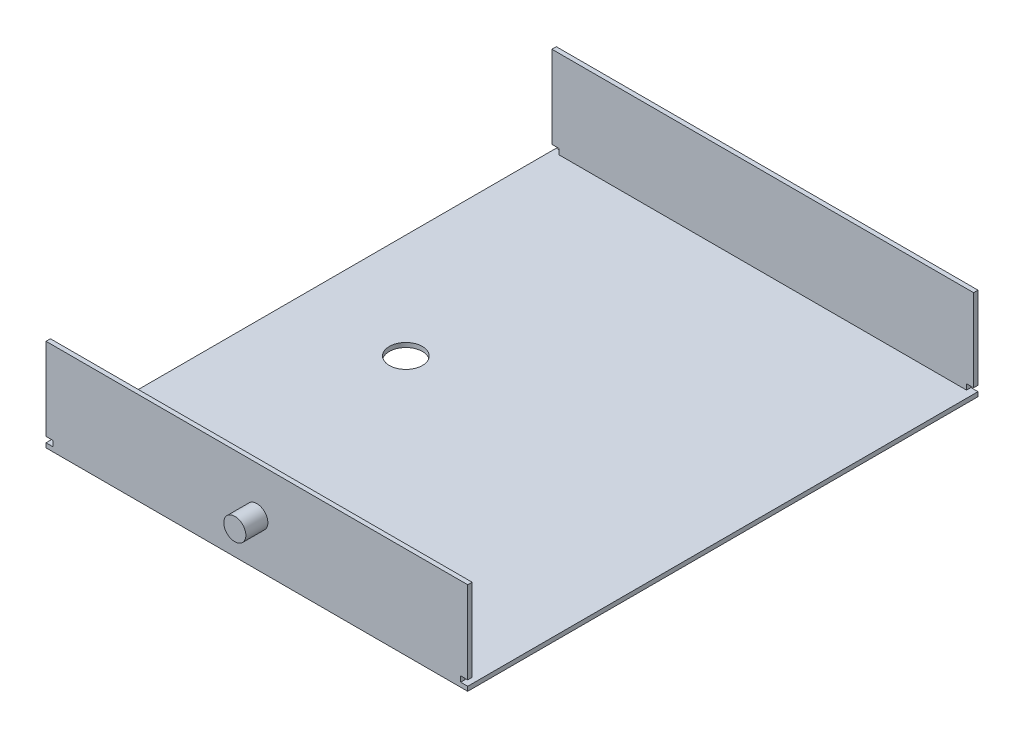
ISO-10303-21;
HEADER;
FILE_DESCRIPTION(('STEP AP214'),'2;1');
FILE_NAME('part.step','',(''),(''),'','','');
FILE_SCHEMA(('AUTOMOTIVE_DESIGN { 1 0 10303 214 1 1 1 1 }'));
ENDSEC;
DATA;
#1=APPLICATION_CONTEXT('core data for automotive mechanical design processes');
#2=APPLICATION_PROTOCOL_DEFINITION('international standard','automotive_design',2000,#1);
#3=PRODUCT_CONTEXT('',#1,'mechanical');
#4=PRODUCT('Part','Part','',(#3));
#5=PRODUCT_RELATED_PRODUCT_CATEGORY('part','',(#4));
#6=PRODUCT_DEFINITION_FORMATION('','',#4);
#7=PRODUCT_DEFINITION_CONTEXT('part definition',#1,'design');
#8=PRODUCT_DEFINITION('design','',#6,#7);
#9=PRODUCT_DEFINITION_SHAPE('','',#8);
#10=(LENGTH_UNIT() NAMED_UNIT(*) SI_UNIT(.MILLI.,.METRE.));
#11=(NAMED_UNIT(*) PLANE_ANGLE_UNIT() SI_UNIT($,.RADIAN.));
#12=(NAMED_UNIT(*) SI_UNIT($,.STERADIAN.) SOLID_ANGLE_UNIT());
#13=UNCERTAINTY_MEASURE_WITH_UNIT(LENGTH_MEASURE(1.E-05),#10,'distance_accuracy_value','');
#14=(GEOMETRIC_REPRESENTATION_CONTEXT(3) GLOBAL_UNCERTAINTY_ASSIGNED_CONTEXT((#13)) GLOBAL_UNIT_ASSIGNED_CONTEXT((#10,
#11,#12)) REPRESENTATION_CONTEXT('',''));
#15=CARTESIAN_POINT('',(0.,0.,0.));
#16=DIRECTION('',(0.,0.,1.));
#17=DIRECTION('',(1.,0.,0.));
#18=AXIS2_PLACEMENT_3D('',#15,#16,#17);
#19=CARTESIAN_POINT('',(0.,2.,0.));
#20=DIRECTION('',(0.,1.,0.));
#21=DIRECTION('',(0.,0.,1.));
#22=AXIS2_PLACEMENT_3D('',#19,#20,#21);
#23=PLANE('',#22);
#24=CARTESIAN_POINT('',(-48.1707335310227,2.,0.));
#25=DIRECTION('',(0.,1.,0.));
#26=DIRECTION('',(0.,0.,1.));
#27=AXIS2_PLACEMENT_3D('',#24,#25,#26);
#28=CIRCLE('',#27,7.5);
#29=CARTESIAN_POINT('',(-48.1707335310227,2.,7.5));
#30=VERTEX_POINT('',#29);
#31=EDGE_CURVE('E375',#30,#30,#28,.T.);
#32=ORIENTED_EDGE('',*,*,#31,.F.);
#33=EDGE_LOOP('',(#32));
#34=FACE_BOUND('',#33,.T.);
#35=DIRECTION('',(1.,0.,0.));
#36=VECTOR('',#35,1.);
#37=CARTESIAN_POINT('',(95.7,2.,115.8));
#38=LINE('',#37,#36);
#39=CARTESIAN_POINT('',(-95.7,2.,115.8));
#40=VERTEX_POINT('',#39);
#41=CARTESIAN_POINT('',(-92.5000000000001,2.,115.8));
#42=VERTEX_POINT('',#41);
#43=EDGE_CURVE('E308',#40,#42,#38,.T.);
#44=ORIENTED_EDGE('',*,*,#43,.T.);
#45=DIRECTION('',(0.,0.,1.));
#46=VECTOR('',#45,1.);
#47=CARTESIAN_POINT('',(-92.5000000000001,2.,115.8));
#48=LINE('',#47,#46);
#49=CARTESIAN_POINT('',(-92.5000000000001,2.,113.8));
#50=VERTEX_POINT('',#49);
#51=EDGE_CURVE('E272',#50,#42,#48,.T.);
#52=ORIENTED_EDGE('',*,*,#51,.F.);
#53=DIRECTION('',(-1.,0.,0.));
#54=VECTOR('',#53,1.);
#55=CARTESIAN_POINT('',(-92.5000000000001,2.,113.8));
#56=LINE('',#55,#54);
#57=CARTESIAN_POINT('',(92.4999999999998,2.,113.8));
#58=VERTEX_POINT('',#57);
#59=EDGE_CURVE('E267',#58,#50,#56,.T.);
#60=ORIENTED_EDGE('',*,*,#59,.F.);
#61=DIRECTION('',(0.,0.,-1.));
#62=VECTOR('',#61,1.);
#63=CARTESIAN_POINT('',(92.4999999999998,2.,115.8));
#64=LINE('',#63,#62);
#65=CARTESIAN_POINT('',(92.4999999999998,2.,115.8));
#66=VERTEX_POINT('',#65);
#67=EDGE_CURVE('E269',#66,#58,#64,.T.);
#68=ORIENTED_EDGE('',*,*,#67,.F.);
#69=CARTESIAN_POINT('',(95.7,2.,115.8));
#70=VERTEX_POINT('',#69);
#71=EDGE_CURVE('E306',#66,#70,#38,.T.);
#72=ORIENTED_EDGE('',*,*,#71,.T.);
#73=DIRECTION('',(0.,0.,-1.));
#74=VECTOR('',#73,1.);
#75=CARTESIAN_POINT('',(95.7,2.,115.8));
#76=LINE('',#75,#74);
#77=CARTESIAN_POINT('',(95.7,2.,-115.8));
#78=VERTEX_POINT('',#77);
#79=EDGE_CURVE('E311',#70,#78,#76,.T.);
#80=ORIENTED_EDGE('',*,*,#79,.T.);
#81=DIRECTION('',(-1.,0.,0.));
#82=VECTOR('',#81,1.);
#83=CARTESIAN_POINT('',(95.7,2.,-115.8));
#84=LINE('',#83,#82);
#85=CARTESIAN_POINT('',(92.5,2.,-115.8));
#86=VERTEX_POINT('',#85);
#87=EDGE_CURVE('E314',#78,#86,#84,.T.);
#88=ORIENTED_EDGE('',*,*,#87,.T.);
#89=DIRECTION('',(0.,0.,-1.));
#90=VECTOR('',#89,1.);
#91=CARTESIAN_POINT('',(92.5,2.,-115.8));
#92=LINE('',#91,#90);
#93=CARTESIAN_POINT('',(92.5,2.,-113.8));
#94=VERTEX_POINT('',#93);
#95=EDGE_CURVE('E283',#94,#86,#92,.T.);
#96=ORIENTED_EDGE('',*,*,#95,.F.);
#97=DIRECTION('',(1.,0.,0.));
#98=VECTOR('',#97,1.);
#99=CARTESIAN_POINT('',(-92.5,2.,-113.8));
#100=LINE('',#99,#98);
#101=CARTESIAN_POINT('',(-92.5,2.,-113.8));
#102=VERTEX_POINT('',#101);
#103=EDGE_CURVE('E74',#102,#94,#100,.T.);
#104=ORIENTED_EDGE('',*,*,#103,.F.);
#105=DIRECTION('',(0.,0.,1.));
#106=VECTOR('',#105,1.);
#107=CARTESIAN_POINT('',(-92.5,2.,-115.8));
#108=LINE('',#107,#106);
#109=CARTESIAN_POINT('',(-92.5,2.,-115.8));
#110=VERTEX_POINT('',#109);
#111=EDGE_CURVE('E275',#110,#102,#108,.T.);
#112=ORIENTED_EDGE('',*,*,#111,.F.);
#113=CARTESIAN_POINT('',(-95.7,2.,-115.8));
#114=VERTEX_POINT('',#113);
#115=EDGE_CURVE('E313',#110,#114,#84,.T.);
#116=ORIENTED_EDGE('',*,*,#115,.T.);
#117=DIRECTION('',(0.,0.,1.));
#118=VECTOR('',#117,1.);
#119=CARTESIAN_POINT('',(-95.7,2.,115.8));
#120=LINE('',#119,#118);
#121=EDGE_CURVE('E303',#114,#40,#120,.T.);
#122=ORIENTED_EDGE('',*,*,#121,.T.);
#123=EDGE_LOOP('',(#44,#52,#60,#68,#72,#80,#88,#96,#104,#112,#116,#122));
#124=FACE_BOUND('',#123,.T.);
#125=ADVANCED_FACE('F51',(#34,#124),#23,.T.);
#126=CARTESIAN_POINT('',(-95.7,2.,115.8));
#127=DIRECTION('',(1.,0.,0.));
#128=DIRECTION('',(0.,0.,-1.));
#129=AXIS2_PLACEMENT_3D('',#126,#127,#128);
#130=PLANE('',#129);
#131=DIRECTION('',(0.,0.,1.));
#132=VECTOR('',#131,1.);
#133=CARTESIAN_POINT('',(-95.7,0.,115.8));
#134=LINE('',#133,#132);
#135=CARTESIAN_POINT('',(-95.7,0.,-115.8));
#136=VERTEX_POINT('',#135);
#137=CARTESIAN_POINT('',(-95.7,0.,115.8));
#138=VERTEX_POINT('',#137);
#139=EDGE_CURVE('E302',#136,#138,#134,.T.);
#140=ORIENTED_EDGE('',*,*,#139,.T.);
#141=DIRECTION('',(0.,-1.,0.));
#142=VECTOR('',#141,1.);
#143=CARTESIAN_POINT('',(-95.7,2.,115.8));
#144=LINE('',#143,#142);
#145=EDGE_CURVE('E59',#40,#138,#144,.T.);
#146=ORIENTED_EDGE('',*,*,#145,.F.);
#147=ORIENTED_EDGE('',*,*,#121,.F.);
#148=DIRECTION('',(0.,-1.,0.));
#149=VECTOR('',#148,1.);
#150=CARTESIAN_POINT('',(-95.7,2.,-115.8));
#151=LINE('',#150,#149);
#152=EDGE_CURVE('E316',#114,#136,#151,.T.);
#153=ORIENTED_EDGE('',*,*,#152,.T.);
#154=EDGE_LOOP('',(#140,#146,#147,#153));
#155=FACE_BOUND('',#154,.T.);
#156=ADVANCED_FACE('F53',(#155),#130,.F.);
#157=CARTESIAN_POINT('',(95.7,2.,115.8));
#158=DIRECTION('',(0.,0.,-1.));
#159=DIRECTION('',(-1.,0.,0.));
#160=AXIS2_PLACEMENT_3D('',#157,#158,#159);
#161=PLANE('',#160);
#162=CARTESIAN_POINT('',(0.,20.95,115.8));
#163=DIRECTION('',(0.,0.,-1.));
#164=DIRECTION('',(-1.,0.,0.));
#165=AXIS2_PLACEMENT_3D('',#162,#163,#164);
#166=CIRCLE('',#165,5.);
#167=CARTESIAN_POINT('',(-5.00000000000006,20.95,115.8));
#168=VERTEX_POINT('',#167);
#169=EDGE_CURVE('E11',#168,#168,#166,.F.);
#170=ORIENTED_EDGE('',*,*,#169,.F.);
#171=EDGE_LOOP('',(#170));
#172=FACE_BOUND('',#171,.T.);
#173=DIRECTION('',(1.,0.,0.));
#174=VECTOR('',#173,1.);
#175=CARTESIAN_POINT('',(95.7,0.,115.8));
#176=LINE('',#175,#174);
#177=CARTESIAN_POINT('',(95.7,0.,115.8));
#178=VERTEX_POINT('',#177);
#179=EDGE_CURVE('E319',#138,#178,#176,.T.);
#180=ORIENTED_EDGE('',*,*,#179,.T.);
#181=DIRECTION('',(0.,-1.,0.));
#182=VECTOR('',#181,1.);
#183=CARTESIAN_POINT('',(95.7,2.,115.8));
#184=LINE('',#183,#182);
#185=EDGE_CURVE('E329',#70,#178,#184,.T.);
#186=ORIENTED_EDGE('',*,*,#185,.F.);
#187=ORIENTED_EDGE('',*,*,#71,.F.);
#188=DIRECTION('',(0.,-1.,0.));
#189=VECTOR('',#188,1.);
#190=CARTESIAN_POINT('',(92.4999999999998,4.5,115.8));
#191=LINE('',#190,#189);
#192=CARTESIAN_POINT('',(92.4999999999998,4.5,115.8));
#193=VERTEX_POINT('',#192);
#194=EDGE_CURVE('E262',#193,#66,#191,.T.);
#195=ORIENTED_EDGE('',*,*,#194,.F.);
#196=DIRECTION('',(1.,0.,0.));
#197=VECTOR('',#196,1.);
#198=CARTESIAN_POINT('',(-95.7000000000001,4.5,115.8));
#199=LINE('',#198,#197);
#200=CARTESIAN_POINT('',(95.6999999999998,4.5,115.8));
#201=VERTEX_POINT('',#200);
#202=EDGE_CURVE('E220',#193,#201,#199,.T.);
#203=ORIENTED_EDGE('',*,*,#202,.T.);
#204=DIRECTION('',(0.,-1.,0.));
#205=VECTOR('',#204,1.);
#206=CARTESIAN_POINT('',(95.6999999999998,41.9,115.8));
#207=LINE('',#206,#205);
#208=CARTESIAN_POINT('',(95.6999999999998,41.9,115.8));
#209=VERTEX_POINT('',#208);
#210=EDGE_CURVE('E369',#209,#201,#207,.T.);
#211=ORIENTED_EDGE('',*,*,#210,.F.);
#212=DIRECTION('',(1.,0.,0.));
#213=VECTOR('',#212,1.);
#214=CARTESIAN_POINT('',(-95.7000000000001,41.9,115.8));
#215=LINE('',#214,#213);
#216=CARTESIAN_POINT('',(-95.7000000000001,41.9,115.8));
#217=VERTEX_POINT('',#216);
#218=EDGE_CURVE('E227',#217,#209,#215,.T.);
#219=ORIENTED_EDGE('',*,*,#218,.F.);
#220=DIRECTION('',(0.,-1.,0.));
#221=VECTOR('',#220,1.);
#222=CARTESIAN_POINT('',(-95.7000000000001,41.9,115.8));
#223=LINE('',#222,#221);
#224=CARTESIAN_POINT('',(-95.7000000000001,4.5,115.8));
#225=VERTEX_POINT('',#224);
#226=EDGE_CURVE('E367',#217,#225,#223,.T.);
#227=ORIENTED_EDGE('',*,*,#226,.T.);
#228=CARTESIAN_POINT('',(-92.5000000000001,4.5,115.8));
#229=VERTEX_POINT('',#228);
#230=EDGE_CURVE('E213',#225,#229,#199,.T.);
#231=ORIENTED_EDGE('',*,*,#230,.T.);
#232=DIRECTION('',(0.,-1.,0.));
#233=VECTOR('',#232,1.);
#234=CARTESIAN_POINT('',(-92.5000000000001,4.5,115.8));
#235=LINE('',#234,#233);
#236=EDGE_CURVE('E260',#229,#42,#235,.T.);
#237=ORIENTED_EDGE('',*,*,#236,.T.);
#238=ORIENTED_EDGE('',*,*,#43,.F.);
#239=ORIENTED_EDGE('',*,*,#145,.T.);
#240=EDGE_LOOP('',(#180,#186,#187,#195,#203,#211,#219,#227,#231,#237,#238,#239));
#241=FACE_BOUND('',#240,.T.);
#242=ADVANCED_FACE('F334',(#172,#241),#161,.F.);
#243=CARTESIAN_POINT('',(95.7,2.,115.8));
#244=DIRECTION('',(-1.,0.,0.));
#245=DIRECTION('',(0.,0.,1.));
#246=AXIS2_PLACEMENT_3D('',#243,#244,#245);
#247=PLANE('',#246);
#248=DIRECTION('',(0.,0.,-1.));
#249=VECTOR('',#248,1.);
#250=CARTESIAN_POINT('',(95.7,0.,115.8));
#251=LINE('',#250,#249);
#252=CARTESIAN_POINT('',(95.7,0.,-115.8));
#253=VERTEX_POINT('',#252);
#254=EDGE_CURVE('E321',#178,#253,#251,.T.);
#255=ORIENTED_EDGE('',*,*,#254,.T.);
#256=DIRECTION('',(0.,-1.,0.));
#257=VECTOR('',#256,1.);
#258=CARTESIAN_POINT('',(95.7,2.,-115.8));
#259=LINE('',#258,#257);
#260=EDGE_CURVE('E326',#78,#253,#259,.T.);
#261=ORIENTED_EDGE('',*,*,#260,.F.);
#262=ORIENTED_EDGE('',*,*,#79,.F.);
#263=ORIENTED_EDGE('',*,*,#185,.T.);
#264=EDGE_LOOP('',(#255,#261,#262,#263));
#265=FACE_BOUND('',#264,.T.);
#266=ADVANCED_FACE('F346',(#265),#247,.F.);
#267=CARTESIAN_POINT('',(95.7,2.,-115.8));
#268=DIRECTION('',(0.,0.,1.));
#269=DIRECTION('',(1.,0.,0.));
#270=AXIS2_PLACEMENT_3D('',#267,#268,#269);
#271=PLANE('',#270);
#272=DIRECTION('',(-1.,0.,0.));
#273=VECTOR('',#272,1.);
#274=CARTESIAN_POINT('',(95.7,0.,-115.8));
#275=LINE('',#274,#273);
#276=EDGE_CURVE('E307',#253,#136,#275,.T.);
#277=ORIENTED_EDGE('',*,*,#276,.T.);
#278=ORIENTED_EDGE('',*,*,#152,.F.);
#279=ORIENTED_EDGE('',*,*,#115,.F.);
#280=DIRECTION('',(0.,-1.,0.));
#281=VECTOR('',#280,1.);
#282=CARTESIAN_POINT('',(-92.5,4.5,-115.8));
#283=LINE('',#282,#281);
#284=CARTESIAN_POINT('',(-92.5,4.5,-115.8));
#285=VERTEX_POINT('',#284);
#286=EDGE_CURVE('E286',#285,#110,#283,.T.);
#287=ORIENTED_EDGE('',*,*,#286,.F.);
#288=DIRECTION('',(-1.,0.,0.));
#289=VECTOR('',#288,1.);
#290=CARTESIAN_POINT('',(-95.7,4.5,-115.8));
#291=LINE('',#290,#289);
#292=CARTESIAN_POINT('',(-95.7,4.5,-115.8));
#293=VERTEX_POINT('',#292);
#294=EDGE_CURVE('E246',#285,#293,#291,.T.);
#295=ORIENTED_EDGE('',*,*,#294,.T.);
#296=DIRECTION('',(0.,-1.,0.));
#297=VECTOR('',#296,1.);
#298=CARTESIAN_POINT('',(-95.7,41.9,-115.8));
#299=LINE('',#298,#297);
#300=CARTESIAN_POINT('',(-95.7,41.9,-115.8));
#301=VERTEX_POINT('',#300);
#302=EDGE_CURVE('E239',#301,#293,#299,.T.);
#303=ORIENTED_EDGE('',*,*,#302,.F.);
#304=DIRECTION('',(-1.,0.,0.));
#305=VECTOR('',#304,1.);
#306=CARTESIAN_POINT('',(-95.7,41.9,-115.8));
#307=LINE('',#306,#305);
#308=CARTESIAN_POINT('',(95.7,41.9,-115.8));
#309=VERTEX_POINT('',#308);
#310=EDGE_CURVE('E238',#309,#301,#307,.T.);
#311=ORIENTED_EDGE('',*,*,#310,.F.);
#312=DIRECTION('',(0.,-1.,0.));
#313=VECTOR('',#312,1.);
#314=CARTESIAN_POINT('',(95.7,41.9,-115.8));
#315=LINE('',#314,#313);
#316=CARTESIAN_POINT('',(95.7,4.5,-115.8));
#317=VERTEX_POINT('',#316);
#318=EDGE_CURVE('E251',#309,#317,#315,.T.);
#319=ORIENTED_EDGE('',*,*,#318,.T.);
#320=CARTESIAN_POINT('',(92.5,4.5,-115.8));
#321=VERTEX_POINT('',#320);
#322=EDGE_CURVE('E234',#317,#321,#291,.T.);
#323=ORIENTED_EDGE('',*,*,#322,.T.);
#324=DIRECTION('',(0.,-1.,0.));
#325=VECTOR('',#324,1.);
#326=CARTESIAN_POINT('',(92.5,4.5,-115.8));
#327=LINE('',#326,#325);
#328=EDGE_CURVE('E294',#321,#86,#327,.T.);
#329=ORIENTED_EDGE('',*,*,#328,.T.);
#330=ORIENTED_EDGE('',*,*,#87,.F.);
#331=ORIENTED_EDGE('',*,*,#260,.T.);
#332=EDGE_LOOP('',(#277,#278,#279,#287,#295,#303,#311,#319,#323,#329,#330,#331));
#333=FACE_BOUND('',#332,.T.);
#334=ADVANCED_FACE('F350',(#333),#271,.F.);
#335=CARTESIAN_POINT('',(0.,0.,0.));
#336=DIRECTION('',(0.,1.,0.));
#337=DIRECTION('',(0.,0.,1.));
#338=AXIS2_PLACEMENT_3D('',#335,#336,#337);
#339=PLANE('',#338);
#340=CARTESIAN_POINT('',(-48.1707335310227,0.,0.));
#341=DIRECTION('',(0.,-1.,0.));
#342=DIRECTION('',(0.,0.,-1.));
#343=AXIS2_PLACEMENT_3D('',#340,#341,#342);
#344=CIRCLE('',#343,7.5);
#345=CARTESIAN_POINT('',(-48.1707335310227,0.,-7.5));
#346=VERTEX_POINT('',#345);
#347=EDGE_CURVE('E635',#346,#346,#344,.T.);
#348=ORIENTED_EDGE('',*,*,#347,.F.);
#349=EDGE_LOOP('',(#348));
#350=FACE_BOUND('',#349,.T.);
#351=ORIENTED_EDGE('',*,*,#139,.F.);
#352=ORIENTED_EDGE('',*,*,#276,.F.);
#353=ORIENTED_EDGE('',*,*,#254,.F.);
#354=ORIENTED_EDGE('',*,*,#179,.F.);
#355=EDGE_LOOP('',(#351,#352,#353,#354));
#356=FACE_BOUND('',#355,.T.);
#357=ADVANCED_FACE('F342',(#350,#356),#339,.F.);
#358=CARTESIAN_POINT('',(-92.5,4.5,-115.8));
#359=DIRECTION('',(1.,0.,0.));
#360=DIRECTION('',(0.,0.,-1.));
#361=AXIS2_PLACEMENT_3D('',#358,#359,#360);
#362=PLANE('',#361);
#363=ORIENTED_EDGE('',*,*,#111,.T.);
#364=DIRECTION('',(0.,-1.,0.));
#365=VECTOR('',#364,1.);
#366=CARTESIAN_POINT('',(-92.5,4.5,-113.8));
#367=LINE('',#366,#365);
#368=CARTESIAN_POINT('',(-92.5,4.5,-113.8));
#369=VERTEX_POINT('',#368);
#370=EDGE_CURVE('E300',#369,#102,#367,.T.);
#371=ORIENTED_EDGE('',*,*,#370,.F.);
#372=DIRECTION('',(0.,0.,1.));
#373=VECTOR('',#372,1.);
#374=CARTESIAN_POINT('',(-92.5,4.5,-115.8));
#375=LINE('',#374,#373);
#376=EDGE_CURVE('E279',#285,#369,#375,.T.);
#377=ORIENTED_EDGE('',*,*,#376,.F.);
#378=ORIENTED_EDGE('',*,*,#286,.T.);
#379=EDGE_LOOP('',(#363,#371,#377,#378));
#380=FACE_BOUND('',#379,.T.);
#381=ADVANCED_FACE('F360',(#380),#362,.F.);
#382=CARTESIAN_POINT('',(-92.5,4.5,-113.8));
#383=DIRECTION('',(0.,0.,-1.));
#384=DIRECTION('',(-1.,0.,0.));
#385=AXIS2_PLACEMENT_3D('',#382,#383,#384);
#386=PLANE('',#385);
#387=ORIENTED_EDGE('',*,*,#103,.T.);
#388=DIRECTION('',(0.,-1.,0.));
#389=VECTOR('',#388,1.);
#390=CARTESIAN_POINT('',(92.5,4.5,-113.8));
#391=LINE('',#390,#389);
#392=CARTESIAN_POINT('',(92.5,4.5,-113.8));
#393=VERTEX_POINT('',#392);
#394=EDGE_CURVE('E297',#393,#94,#391,.T.);
#395=ORIENTED_EDGE('',*,*,#394,.F.);
#396=DIRECTION('',(1.,0.,0.));
#397=VECTOR('',#396,1.);
#398=CARTESIAN_POINT('',(-95.7,4.5,-113.8));
#399=LINE('',#398,#397);
#400=CARTESIAN_POINT('',(95.7,4.5,-113.8));
#401=VERTEX_POINT('',#400);
#402=EDGE_CURVE('E218',#393,#401,#399,.T.);
#403=ORIENTED_EDGE('',*,*,#402,.T.);
#404=DIRECTION('',(0.,-1.,0.));
#405=VECTOR('',#404,1.);
#406=CARTESIAN_POINT('',(95.7,41.9,-113.8));
#407=LINE('',#406,#405);
#408=CARTESIAN_POINT('',(95.7,41.9,-113.8));
#409=VERTEX_POINT('',#408);
#410=EDGE_CURVE('E254',#409,#401,#407,.T.);
#411=ORIENTED_EDGE('',*,*,#410,.F.);
#412=DIRECTION('',(1.,0.,0.));
#413=VECTOR('',#412,1.);
#414=CARTESIAN_POINT('',(-95.7,41.9,-113.8));
#415=LINE('',#414,#413);
#416=CARTESIAN_POINT('',(-95.7,41.9,-113.8));
#417=VERTEX_POINT('',#416);
#418=EDGE_CURVE('E233',#417,#409,#415,.T.);
#419=ORIENTED_EDGE('',*,*,#418,.F.);
#420=DIRECTION('',(0.,-1.,0.));
#421=VECTOR('',#420,1.);
#422=CARTESIAN_POINT('',(-95.7,41.9,-113.8));
#423=LINE('',#422,#421);
#424=CARTESIAN_POINT('',(-95.7,4.5,-113.8));
#425=VERTEX_POINT('',#424);
#426=EDGE_CURVE('E257',#417,#425,#423,.T.);
#427=ORIENTED_EDGE('',*,*,#426,.T.);
#428=EDGE_CURVE('E241',#425,#369,#399,.T.);
#429=ORIENTED_EDGE('',*,*,#428,.T.);
#430=ORIENTED_EDGE('',*,*,#370,.T.);
#431=EDGE_LOOP('',(#387,#395,#403,#411,#419,#427,#429,#430));
#432=FACE_BOUND('',#431,.T.);
#433=ADVANCED_FACE('F356',(#432),#386,.F.);
#434=CARTESIAN_POINT('',(92.5,4.5,-115.8));
#435=DIRECTION('',(-1.,0.,0.));
#436=DIRECTION('',(0.,0.,1.));
#437=AXIS2_PLACEMENT_3D('',#434,#435,#436);
#438=PLANE('',#437);
#439=ORIENTED_EDGE('',*,*,#95,.T.);
#440=ORIENTED_EDGE('',*,*,#328,.F.);
#441=DIRECTION('',(0.,0.,-1.));
#442=VECTOR('',#441,1.);
#443=CARTESIAN_POINT('',(92.5,4.5,-115.8));
#444=LINE('',#443,#442);
#445=EDGE_CURVE('E282',#393,#321,#444,.T.);
#446=ORIENTED_EDGE('',*,*,#445,.F.);
#447=ORIENTED_EDGE('',*,*,#394,.T.);
#448=EDGE_LOOP('',(#439,#440,#446,#447));
#449=FACE_BOUND('',#448,.T.);
#450=ADVANCED_FACE('F352',(#449),#438,.F.);
#451=CARTESIAN_POINT('',(-92.5000000000001,4.5,115.8));
#452=DIRECTION('',(1.,0.,0.));
#453=DIRECTION('',(0.,0.,-1.));
#454=AXIS2_PLACEMENT_3D('',#451,#452,#453);
#455=PLANE('',#454);
#456=ORIENTED_EDGE('',*,*,#51,.T.);
#457=ORIENTED_EDGE('',*,*,#236,.F.);
#458=DIRECTION('',(0.,0.,1.));
#459=VECTOR('',#458,1.);
#460=CARTESIAN_POINT('',(-92.5000000000001,4.5,115.8));
#461=LINE('',#460,#459);
#462=CARTESIAN_POINT('',(-92.5000000000001,4.5,113.8));
#463=VERTEX_POINT('',#462);
#464=EDGE_CURVE('E270',#463,#229,#461,.T.);
#465=ORIENTED_EDGE('',*,*,#464,.F.);
#466=DIRECTION('',(0.,-1.,0.));
#467=VECTOR('',#466,1.);
#468=CARTESIAN_POINT('',(-92.5000000000001,4.5,113.8));
#469=LINE('',#468,#467);
#470=EDGE_CURVE('E194',#463,#50,#469,.T.);
#471=ORIENTED_EDGE('',*,*,#470,.T.);
#472=EDGE_LOOP('',(#456,#457,#465,#471));
#473=FACE_BOUND('',#472,.T.);
#474=ADVANCED_FACE('F366',(#473),#455,.F.);
#475=CARTESIAN_POINT('',(92.4999999999998,4.5,115.8));
#476=DIRECTION('',(-1.,0.,0.));
#477=DIRECTION('',(0.,0.,1.));
#478=AXIS2_PLACEMENT_3D('',#475,#476,#477);
#479=PLANE('',#478);
#480=ORIENTED_EDGE('',*,*,#67,.T.);
#481=DIRECTION('',(0.,-1.,0.));
#482=VECTOR('',#481,1.);
#483=CARTESIAN_POINT('',(92.4999999999998,4.5,113.8));
#484=LINE('',#483,#482);
#485=CARTESIAN_POINT('',(92.4999999999998,4.5,113.8));
#486=VERTEX_POINT('',#485);
#487=EDGE_CURVE('E66',#486,#58,#484,.T.);
#488=ORIENTED_EDGE('',*,*,#487,.F.);
#489=DIRECTION('',(0.,0.,-1.));
#490=VECTOR('',#489,1.);
#491=CARTESIAN_POINT('',(92.4999999999998,4.5,115.8));
#492=LINE('',#491,#490);
#493=EDGE_CURVE('E266',#193,#486,#492,.T.);
#494=ORIENTED_EDGE('',*,*,#493,.F.);
#495=ORIENTED_EDGE('',*,*,#194,.T.);
#496=EDGE_LOOP('',(#480,#488,#494,#495));
#497=FACE_BOUND('',#496,.T.);
#498=ADVANCED_FACE('F467',(#497),#479,.F.);
#499=CARTESIAN_POINT('',(-92.5000000000001,4.5,113.8));
#500=DIRECTION('',(0.,0.,1.));
#501=DIRECTION('',(1.,0.,0.));
#502=AXIS2_PLACEMENT_3D('',#499,#500,#501);
#503=PLANE('',#502);
#504=ORIENTED_EDGE('',*,*,#59,.T.);
#505=ORIENTED_EDGE('',*,*,#470,.F.);
#506=DIRECTION('',(-1.,0.,0.));
#507=VECTOR('',#506,1.);
#508=CARTESIAN_POINT('',(-95.7000000000001,4.5,113.8));
#509=LINE('',#508,#507);
#510=CARTESIAN_POINT('',(-95.7000000000001,4.5,113.8));
#511=VERTEX_POINT('',#510);
#512=EDGE_CURVE('E187',#463,#511,#509,.T.);
#513=ORIENTED_EDGE('',*,*,#512,.T.);
#514=DIRECTION('',(0.,-1.,0.));
#515=VECTOR('',#514,1.);
#516=CARTESIAN_POINT('',(-95.7000000000001,41.9,113.8));
#517=LINE('',#516,#515);
#518=CARTESIAN_POINT('',(-95.7000000000001,41.9,113.8));
#519=VERTEX_POINT('',#518);
#520=EDGE_CURVE('E191',#519,#511,#517,.T.);
#521=ORIENTED_EDGE('',*,*,#520,.F.);
#522=DIRECTION('',(-1.,0.,0.));
#523=VECTOR('',#522,1.);
#524=CARTESIAN_POINT('',(-95.7000000000001,41.9,113.8));
#525=LINE('',#524,#523);
#526=CARTESIAN_POINT('',(95.6999999999998,41.9,113.8));
#527=VERTEX_POINT('',#526);
#528=EDGE_CURVE('E208',#527,#519,#525,.T.);
#529=ORIENTED_EDGE('',*,*,#528,.F.);
#530=DIRECTION('',(0.,-1.,0.));
#531=VECTOR('',#530,1.);
#532=CARTESIAN_POINT('',(95.6999999999998,41.9,113.8));
#533=LINE('',#532,#531);
#534=CARTESIAN_POINT('',(95.6999999999998,4.5,113.8));
#535=VERTEX_POINT('',#534);
#536=EDGE_CURVE('E209',#527,#535,#533,.T.);
#537=ORIENTED_EDGE('',*,*,#536,.T.);
#538=EDGE_CURVE('E199',#535,#486,#509,.T.);
#539=ORIENTED_EDGE('',*,*,#538,.T.);
#540=ORIENTED_EDGE('',*,*,#487,.T.);
#541=EDGE_LOOP('',(#504,#505,#513,#521,#529,#537,#539,#540));
#542=FACE_BOUND('',#541,.T.);
#543=ADVANCED_FACE('F189',(#542),#503,.F.);
#544=CARTESIAN_POINT('',(0.,4.5,0.));
#545=DIRECTION('',(0.,1.,0.));
#546=DIRECTION('',(0.,0.,1.));
#547=AXIS2_PLACEMENT_3D('',#544,#545,#546);
#548=PLANE('',#547);
#549=ORIENTED_EDGE('',*,*,#294,.F.);
#550=ORIENTED_EDGE('',*,*,#376,.T.);
#551=ORIENTED_EDGE('',*,*,#428,.F.);
#552=DIRECTION('',(0.,0.,1.));
#553=VECTOR('',#552,1.);
#554=CARTESIAN_POINT('',(-95.7,4.5,-115.8));
#555=LINE('',#554,#553);
#556=EDGE_CURVE('E215',#293,#425,#555,.T.);
#557=ORIENTED_EDGE('',*,*,#556,.F.);
#558=EDGE_LOOP('',(#549,#550,#551,#557));
#559=FACE_BOUND('',#558,.T.);
#560=ADVANCED_FACE('F457',(#559),#548,.F.);
#561=ORIENTED_EDGE('',*,*,#402,.F.);
#562=ORIENTED_EDGE('',*,*,#445,.T.);
#563=ORIENTED_EDGE('',*,*,#322,.F.);
#564=DIRECTION('',(0.,0.,-1.));
#565=VECTOR('',#564,1.);
#566=CARTESIAN_POINT('',(95.7,4.5,-115.8));
#567=LINE('',#566,#565);
#568=EDGE_CURVE('E244',#401,#317,#567,.T.);
#569=ORIENTED_EDGE('',*,*,#568,.F.);
#570=EDGE_LOOP('',(#561,#562,#563,#569));
#571=FACE_BOUND('',#570,.T.);
#572=ADVANCED_FACE('F459',(#571),#548,.F.);
#573=CARTESIAN_POINT('',(-95.7,41.9,-115.8));
#574=DIRECTION('',(1.,0.,0.));
#575=DIRECTION('',(0.,0.,-1.));
#576=AXIS2_PLACEMENT_3D('',#573,#574,#575);
#577=PLANE('',#576);
#578=ORIENTED_EDGE('',*,*,#556,.T.);
#579=ORIENTED_EDGE('',*,*,#426,.F.);
#580=DIRECTION('',(0.,0.,1.));
#581=VECTOR('',#580,1.);
#582=CARTESIAN_POINT('',(-95.7,41.9,-115.8));
#583=LINE('',#582,#581);
#584=EDGE_CURVE('E230',#301,#417,#583,.T.);
#585=ORIENTED_EDGE('',*,*,#584,.F.);
#586=ORIENTED_EDGE('',*,*,#302,.T.);
#587=EDGE_LOOP('',(#578,#579,#585,#586));
#588=FACE_BOUND('',#587,.T.);
#589=ADVANCED_FACE('F453',(#588),#577,.F.);
#590=CARTESIAN_POINT('',(95.7,41.9,-115.8));
#591=DIRECTION('',(-1.,0.,0.));
#592=DIRECTION('',(0.,0.,1.));
#593=AXIS2_PLACEMENT_3D('',#590,#591,#592);
#594=PLANE('',#593);
#595=ORIENTED_EDGE('',*,*,#568,.T.);
#596=ORIENTED_EDGE('',*,*,#318,.F.);
#597=DIRECTION('',(0.,0.,-1.));
#598=VECTOR('',#597,1.);
#599=CARTESIAN_POINT('',(95.7,41.9,-115.8));
#600=LINE('',#599,#598);
#601=EDGE_CURVE('E236',#409,#309,#600,.T.);
#602=ORIENTED_EDGE('',*,*,#601,.F.);
#603=ORIENTED_EDGE('',*,*,#410,.T.);
#604=EDGE_LOOP('',(#595,#596,#602,#603));
#605=FACE_BOUND('',#604,.T.);
#606=ADVANCED_FACE('F448',(#605),#594,.F.);
#607=CARTESIAN_POINT('',(0.,41.9,0.));
#608=DIRECTION('',(0.,1.,0.));
#609=DIRECTION('',(0.,0.,1.));
#610=AXIS2_PLACEMENT_3D('',#607,#608,#609);
#611=PLANE('',#610);
#612=ORIENTED_EDGE('',*,*,#584,.T.);
#613=ORIENTED_EDGE('',*,*,#418,.T.);
#614=ORIENTED_EDGE('',*,*,#601,.T.);
#615=ORIENTED_EDGE('',*,*,#310,.T.);
#616=EDGE_LOOP('',(#612,#613,#614,#615));
#617=FACE_BOUND('',#616,.T.);
#618=ADVANCED_FACE('F444',(#617),#611,.T.);
#619=CARTESIAN_POINT('',(0.,4.5,0.));
#620=DIRECTION('',(0.,-1.,0.));
#621=DIRECTION('',(0.,0.,-1.));
#622=AXIS2_PLACEMENT_3D('',#619,#620,#621);
#623=PLANE('',#622);
#624=ORIENTED_EDGE('',*,*,#512,.F.);
#625=ORIENTED_EDGE('',*,*,#464,.T.);
#626=ORIENTED_EDGE('',*,*,#230,.F.);
#627=DIRECTION('',(0.,0.,1.));
#628=VECTOR('',#627,1.);
#629=CARTESIAN_POINT('',(-95.7000000000001,4.5,115.8));
#630=LINE('',#629,#628);
#631=EDGE_CURVE('E206',#511,#225,#630,.T.);
#632=ORIENTED_EDGE('',*,*,#631,.F.);
#633=EDGE_LOOP('',(#624,#625,#626,#632));
#634=FACE_BOUND('',#633,.T.);
#635=ADVANCED_FACE('F211',(#634),#623,.T.);
#636=CARTESIAN_POINT('',(-95.7000000000001,41.9,115.8));
#637=DIRECTION('',(1.,0.,0.));
#638=DIRECTION('',(0.,0.,-1.));
#639=AXIS2_PLACEMENT_3D('',#636,#637,#638);
#640=PLANE('',#639);
#641=ORIENTED_EDGE('',*,*,#631,.T.);
#642=ORIENTED_EDGE('',*,*,#226,.F.);
#643=DIRECTION('',(0.,0.,1.));
#644=VECTOR('',#643,1.);
#645=CARTESIAN_POINT('',(-95.7000000000001,41.9,115.8));
#646=LINE('',#645,#644);
#647=EDGE_CURVE('E200',#519,#217,#646,.T.);
#648=ORIENTED_EDGE('',*,*,#647,.F.);
#649=ORIENTED_EDGE('',*,*,#520,.T.);
#650=EDGE_LOOP('',(#641,#642,#648,#649));
#651=FACE_BOUND('',#650,.T.);
#652=ADVANCED_FACE('F204',(#651),#640,.F.);
#653=CARTESIAN_POINT('',(95.6999999999998,41.9,115.8));
#654=DIRECTION('',(-1.,0.,0.));
#655=DIRECTION('',(0.,0.,1.));
#656=AXIS2_PLACEMENT_3D('',#653,#654,#655);
#657=PLANE('',#656);
#658=DIRECTION('',(0.,0.,-1.));
#659=VECTOR('',#658,1.);
#660=CARTESIAN_POINT('',(95.6999999999998,4.5,115.8));
#661=LINE('',#660,#659);
#662=EDGE_CURVE('E380',#201,#535,#661,.T.);
#663=ORIENTED_EDGE('',*,*,#662,.T.);
#664=ORIENTED_EDGE('',*,*,#536,.F.);
#665=DIRECTION('',(0.,0.,-1.));
#666=VECTOR('',#665,1.);
#667=CARTESIAN_POINT('',(95.6999999999998,41.9,115.8));
#668=LINE('',#667,#666);
#669=EDGE_CURVE('E225',#209,#527,#668,.T.);
#670=ORIENTED_EDGE('',*,*,#669,.F.);
#671=ORIENTED_EDGE('',*,*,#210,.T.);
#672=EDGE_LOOP('',(#663,#664,#670,#671));
#673=FACE_BOUND('',#672,.T.);
#674=ADVANCED_FACE('F389',(#673),#657,.F.);
#675=CARTESIAN_POINT('',(0.,41.9,0.));
#676=DIRECTION('',(0.,-1.,0.));
#677=DIRECTION('',(0.,0.,-1.));
#678=AXIS2_PLACEMENT_3D('',#675,#676,#677);
#679=PLANE('',#678);
#680=ORIENTED_EDGE('',*,*,#647,.T.);
#681=ORIENTED_EDGE('',*,*,#218,.T.);
#682=ORIENTED_EDGE('',*,*,#669,.T.);
#683=ORIENTED_EDGE('',*,*,#528,.T.);
#684=EDGE_LOOP('',(#680,#681,#682,#683));
#685=FACE_BOUND('',#684,.T.);
#686=ADVANCED_FACE('F393',(#685),#679,.F.);
#687=ORIENTED_EDGE('',*,*,#202,.F.);
#688=ORIENTED_EDGE('',*,*,#493,.T.);
#689=ORIENTED_EDGE('',*,*,#538,.F.);
#690=ORIENTED_EDGE('',*,*,#662,.F.);
#691=EDGE_LOOP('',(#687,#688,#689,#690));
#692=FACE_BOUND('',#691,.T.);
#693=ADVANCED_FACE('F391',(#692),#623,.T.);
#694=CARTESIAN_POINT('',(0.,20.95,125.8));
#695=DIRECTION('',(0.,0.,-1.));
#696=DIRECTION('',(-1.,0.,0.));
#697=AXIS2_PLACEMENT_3D('',#694,#695,#696);
#698=CYLINDRICAL_SURFACE('',#697,5.);
#699=CARTESIAN_POINT('',(0.,20.95,125.8));
#700=DIRECTION('',(0.,0.,1.));
#701=DIRECTION('',(1.,0.,0.));
#702=AXIS2_PLACEMENT_3D('',#699,#700,#701);
#703=CIRCLE('',#702,5.);
#704=CARTESIAN_POINT('',(4.99999999999994,20.95,125.8));
#705=VERTEX_POINT('',#704);
#706=EDGE_CURVE('E370',#705,#705,#703,.T.);
#707=ORIENTED_EDGE('',*,*,#706,.F.);
#708=EDGE_LOOP('',(#707));
#709=FACE_BOUND('',#708,.T.);
#710=ORIENTED_EDGE('',*,*,#169,.T.);
#711=EDGE_LOOP('',(#710));
#712=FACE_BOUND('',#711,.T.);
#713=ADVANCED_FACE('F400',(#709,#712),#698,.T.);
#714=CARTESIAN_POINT('',(0.,20.95,125.8));
#715=DIRECTION('',(0.,0.,1.));
#716=DIRECTION('',(1.,0.,0.));
#717=AXIS2_PLACEMENT_3D('',#714,#715,#716);
#718=PLANE('',#717);
#719=ORIENTED_EDGE('',*,*,#706,.T.);
#720=EDGE_LOOP('',(#719));
#721=FACE_BOUND('',#720,.T.);
#722=ADVANCED_FACE('F428',(#721),#718,.T.);
#723=CARTESIAN_POINT('',(-48.1707335310227,10.,0.));
#724=DIRECTION('',(0.,-1.,0.));
#725=DIRECTION('',(0.,0.,-1.));
#726=AXIS2_PLACEMENT_3D('',#723,#724,#725);
#727=CYLINDRICAL_SURFACE('',#726,7.5);
#728=ORIENTED_EDGE('',*,*,#31,.T.);
#729=EDGE_LOOP('',(#728));
#730=FACE_BOUND('',#729,.T.);
#731=ORIENTED_EDGE('',*,*,#347,.T.);
#732=EDGE_LOOP('',(#731));
#733=FACE_BOUND('',#732,.T.);
#734=ADVANCED_FACE('F434',(#730,#733),#727,.F.);
#735=CLOSED_SHELL('',(#125,#156,#242,#266,#334,#357,#381,#433,#450,#474,#498,#543,#560,#572,
#589,#606,#618,#635,#652,#674,#686,#693,#713,#722,#734));
#736=MANIFOLD_SOLID_BREP('B2',#735);
#737=ADVANCED_BREP_SHAPE_REPRESENTATION('',(#18,#736),#14);
#738=SHAPE_DEFINITION_REPRESENTATION(#9,#737);
ENDSEC;
END-ISO-10303-21;
